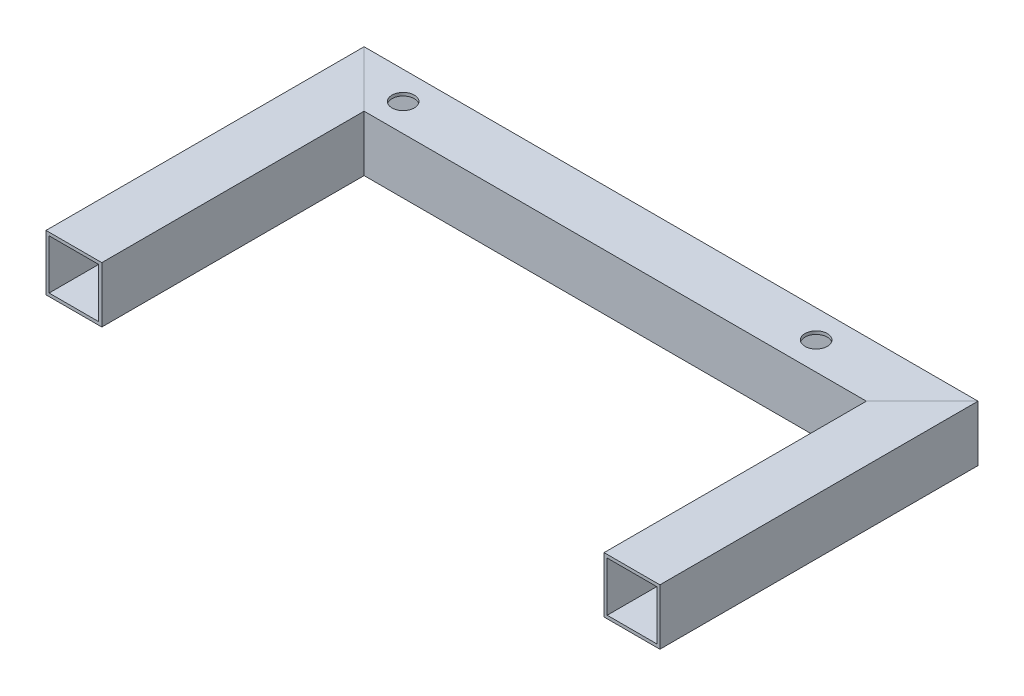
ISO-10303-21;
HEADER;
FILE_DESCRIPTION(('STEP AP214'),'2;1');
FILE_NAME('part.step','',(''),(''),'','','');
FILE_SCHEMA(('AUTOMOTIVE_DESIGN { 1 0 10303 214 1 1 1 1 }'));
ENDSEC;
DATA;
#1=APPLICATION_CONTEXT('core data for automotive mechanical design processes');
#2=APPLICATION_PROTOCOL_DEFINITION('international standard','automotive_design',2000,#1);
#3=PRODUCT_CONTEXT('',#1,'mechanical');
#4=PRODUCT('Part','Part','',(#3));
#5=PRODUCT_RELATED_PRODUCT_CATEGORY('part','',(#4));
#6=PRODUCT_DEFINITION_FORMATION('','',#4);
#7=PRODUCT_DEFINITION_CONTEXT('part definition',#1,'design');
#8=PRODUCT_DEFINITION('design','',#6,#7);
#9=PRODUCT_DEFINITION_SHAPE('','',#8);
#10=(LENGTH_UNIT() NAMED_UNIT(*) SI_UNIT(.MILLI.,.METRE.));
#11=(NAMED_UNIT(*) PLANE_ANGLE_UNIT() SI_UNIT($,.RADIAN.));
#12=(NAMED_UNIT(*) SI_UNIT($,.STERADIAN.) SOLID_ANGLE_UNIT());
#13=UNCERTAINTY_MEASURE_WITH_UNIT(LENGTH_MEASURE(1.E-05),#10,'distance_accuracy_value','');
#14=(GEOMETRIC_REPRESENTATION_CONTEXT(3) GLOBAL_UNCERTAINTY_ASSIGNED_CONTEXT((#13)) GLOBAL_UNIT_ASSIGNED_CONTEXT((#10,
#11,#12)) REPRESENTATION_CONTEXT('',''));
#15=CARTESIAN_POINT('',(0.,0.,0.));
#16=DIRECTION('',(0.,0.,1.));
#17=DIRECTION('',(1.,0.,0.));
#18=AXIS2_PLACEMENT_3D('',#15,#16,#17);
#19=CARTESIAN_POINT('',(137.5,-12.5,-13.8500000000001));
#20=DIRECTION('',(1.,0.,0.));
#21=DIRECTION('',(0.,0.,-1.));
#22=AXIS2_PLACEMENT_3D('',#19,#20,#21);
#23=PLANE('',#22);
#24=DIRECTION('',(0.,-1.,0.));
#25=VECTOR('',#24,1.);
#26=CARTESIAN_POINT('',(137.5,-12.5,-12.5000000000001));
#27=LINE('',#26,#25);
#28=CARTESIAN_POINT('',(137.5,12.5,-12.5000000000001));
#29=VERTEX_POINT('',#28);
#30=CARTESIAN_POINT('',(137.5,-12.5,-12.5000000000001));
#31=VERTEX_POINT('',#30);
#32=EDGE_CURVE('E196',#29,#31,#27,.T.);
#33=ORIENTED_EDGE('',*,*,#32,.F.);
#34=DIRECTION('',(0.,0.,1.));
#35=VECTOR('',#34,1.);
#36=CARTESIAN_POINT('',(137.5,12.5,-13.8500000000001));
#37=LINE('',#36,#35);
#38=CARTESIAN_POINT('',(137.5,12.5,130.));
#39=VERTEX_POINT('',#38);
#40=EDGE_CURVE('E152',#29,#39,#37,.T.);
#41=ORIENTED_EDGE('',*,*,#40,.T.);
#42=DIRECTION('',(0.,1.,0.));
#43=VECTOR('',#42,1.);
#44=CARTESIAN_POINT('',(137.5,-12.5,130.));
#45=LINE('',#44,#43);
#46=CARTESIAN_POINT('',(137.5,-12.5,130.));
#47=VERTEX_POINT('',#46);
#48=EDGE_CURVE('E358',#47,#39,#45,.T.);
#49=ORIENTED_EDGE('',*,*,#48,.F.);
#50=DIRECTION('',(0.,0.,1.));
#51=VECTOR('',#50,1.);
#52=CARTESIAN_POINT('',(137.5,-12.5,-13.8500000000001));
#53=LINE('',#52,#51);
#54=EDGE_CURVE('E189',#31,#47,#53,.T.);
#55=ORIENTED_EDGE('',*,*,#54,.F.);
#56=EDGE_LOOP('',(#33,#41,#49,#55));
#57=FACE_BOUND('',#56,.T.);
#58=ADVANCED_FACE('F43',(#57),#23,.T.);
#59=CARTESIAN_POINT('',(112.5,12.5,-13.85));
#60=DIRECTION('',(0.,1.,0.));
#61=DIRECTION('',(0.,0.,1.));
#62=AXIS2_PLACEMENT_3D('',#59,#60,#61);
#63=PLANE('',#62);
#64=DIRECTION('',(0.707106781186547,0.,-0.707106781186548));
#65=VECTOR('',#64,1.);
#66=CARTESIAN_POINT('',(-13.175,12.5,138.175));
#67=LINE('',#66,#65);
#68=CARTESIAN_POINT('',(112.5,12.5,12.5));
#69=VERTEX_POINT('',#68);
#70=EDGE_CURVE('E147',#69,#29,#67,.T.);
#71=ORIENTED_EDGE('',*,*,#70,.F.);
#72=DIRECTION('',(0.,0.,1.));
#73=VECTOR('',#72,1.);
#74=CARTESIAN_POINT('',(112.5,12.5,-13.85));
#75=LINE('',#74,#73);
#76=CARTESIAN_POINT('',(112.5,12.5,130.));
#77=VERTEX_POINT('',#76);
#78=EDGE_CURVE('E149',#69,#77,#75,.T.);
#79=ORIENTED_EDGE('',*,*,#78,.T.);
#80=DIRECTION('',(-1.,0.,0.));
#81=VECTOR('',#80,1.);
#82=CARTESIAN_POINT('',(112.5,12.5,130.));
#83=LINE('',#82,#81);
#84=EDGE_CURVE('E362',#39,#77,#83,.T.);
#85=ORIENTED_EDGE('',*,*,#84,.F.);
#86=ORIENTED_EDGE('',*,*,#40,.F.);
#87=EDGE_LOOP('',(#71,#79,#85,#86));
#88=FACE_BOUND('',#87,.T.);
#89=ADVANCED_FACE('F148',(#88),#63,.T.);
#90=CARTESIAN_POINT('',(112.5,-12.5,-13.85));
#91=DIRECTION('',(-1.,0.,0.));
#92=DIRECTION('',(0.,0.,1.));
#93=AXIS2_PLACEMENT_3D('',#90,#91,#92);
#94=PLANE('',#93);
#95=DIRECTION('',(0.,1.,0.));
#96=VECTOR('',#95,1.);
#97=CARTESIAN_POINT('',(112.5,-12.5,12.5));
#98=LINE('',#97,#96);
#99=CARTESIAN_POINT('',(112.5,-12.5,12.5));
#100=VERTEX_POINT('',#99);
#101=EDGE_CURVE('E140',#100,#69,#98,.T.);
#102=ORIENTED_EDGE('',*,*,#101,.F.);
#103=DIRECTION('',(0.,0.,1.));
#104=VECTOR('',#103,1.);
#105=CARTESIAN_POINT('',(112.5,-12.5,-13.85));
#106=LINE('',#105,#104);
#107=CARTESIAN_POINT('',(112.5,-12.5,130.));
#108=VERTEX_POINT('',#107);
#109=EDGE_CURVE('E164',#100,#108,#106,.T.);
#110=ORIENTED_EDGE('',*,*,#109,.T.);
#111=DIRECTION('',(0.,-1.,0.));
#112=VECTOR('',#111,1.);
#113=CARTESIAN_POINT('',(112.5,-12.5,130.));
#114=LINE('',#113,#112);
#115=EDGE_CURVE('E162',#77,#108,#114,.T.);
#116=ORIENTED_EDGE('',*,*,#115,.F.);
#117=ORIENTED_EDGE('',*,*,#78,.F.);
#118=EDGE_LOOP('',(#102,#110,#116,#117));
#119=FACE_BOUND('',#118,.T.);
#120=ADVANCED_FACE('F160',(#119),#94,.T.);
#121=CARTESIAN_POINT('',(112.5,-12.5,-13.85));
#122=DIRECTION('',(0.,-1.,0.));
#123=DIRECTION('',(1.,0.,0.));
#124=AXIS2_PLACEMENT_3D('',#121,#122,#123);
#125=PLANE('',#124);
#126=DIRECTION('',(-0.707106781186547,0.,0.707106781186548));
#127=VECTOR('',#126,1.);
#128=CARTESIAN_POINT('',(-13.175,-12.5,138.175));
#129=LINE('',#128,#127);
#130=EDGE_CURVE('E175',#31,#100,#129,.T.);
#131=ORIENTED_EDGE('',*,*,#130,.F.);
#132=ORIENTED_EDGE('',*,*,#54,.T.);
#133=DIRECTION('',(1.,0.,0.));
#134=VECTOR('',#133,1.);
#135=CARTESIAN_POINT('',(112.5,-12.5,130.));
#136=LINE('',#135,#134);
#137=EDGE_CURVE('E350',#108,#47,#136,.T.);
#138=ORIENTED_EDGE('',*,*,#137,.F.);
#139=ORIENTED_EDGE('',*,*,#109,.F.);
#140=EDGE_LOOP('',(#131,#132,#138,#139));
#141=FACE_BOUND('',#140,.T.);
#142=ADVANCED_FACE('F45',(#141),#125,.T.);
#143=CARTESIAN_POINT('',(-138.85,-12.5,12.5));
#144=DIRECTION('',(0.,-1.,0.));
#145=DIRECTION('',(0.,0.,-1.));
#146=AXIS2_PLACEMENT_3D('',#143,#144,#145);
#147=PLANE('',#146);
#148=CARTESIAN_POINT('',(77.5,-12.5,0.));
#149=DIRECTION('',(0.,-1.,0.));
#150=DIRECTION('',(0.,0.,-1.));
#151=AXIS2_PLACEMENT_3D('',#148,#149,#150);
#152=CIRCLE('',#151,5.);
#153=CARTESIAN_POINT('',(77.5,-12.5,-5.));
#154=VERTEX_POINT('',#153);
#155=EDGE_CURVE('E211',#154,#154,#152,.F.);
#156=ORIENTED_EDGE('',*,*,#155,.T.);
#157=EDGE_LOOP('',(#156));
#158=FACE_BOUND('',#157,.T.);
#159=CARTESIAN_POINT('',(-107.5,-12.5,0.));
#160=DIRECTION('',(0.,-1.,0.));
#161=DIRECTION('',(0.,0.,-1.));
#162=AXIS2_PLACEMENT_3D('',#159,#160,#161);
#163=CIRCLE('',#162,5.);
#164=CARTESIAN_POINT('',(-107.5,-12.5,-5.));
#165=VERTEX_POINT('',#164);
#166=EDGE_CURVE('E227',#165,#165,#163,.F.);
#167=ORIENTED_EDGE('',*,*,#166,.T.);
#168=EDGE_LOOP('',(#167));
#169=FACE_BOUND('',#168,.T.);
#170=DIRECTION('',(1.,0.,0.));
#171=VECTOR('',#170,1.);
#172=CARTESIAN_POINT('',(-138.85,-12.5,-12.5));
#173=LINE('',#172,#171);
#174=CARTESIAN_POINT('',(-137.5,-12.5,-12.5));
#175=VERTEX_POINT('',#174);
#176=EDGE_CURVE('E187',#175,#31,#173,.T.);
#177=ORIENTED_EDGE('',*,*,#176,.T.);
#178=ORIENTED_EDGE('',*,*,#130,.T.);
#179=DIRECTION('',(1.,0.,0.));
#180=VECTOR('',#179,1.);
#181=CARTESIAN_POINT('',(-138.85,-12.5,12.5));
#182=LINE('',#181,#180);
#183=CARTESIAN_POINT('',(-112.5,-12.5,12.5));
#184=VERTEX_POINT('',#183);
#185=EDGE_CURVE('E173',#184,#100,#182,.T.);
#186=ORIENTED_EDGE('',*,*,#185,.F.);
#187=DIRECTION('',(0.707106781186548,0.,0.707106781186547));
#188=VECTOR('',#187,1.);
#189=CARTESIAN_POINT('',(-53.75,-12.5,71.25));
#190=LINE('',#189,#188);
#191=EDGE_CURVE('E372',#175,#184,#190,.T.);
#192=ORIENTED_EDGE('',*,*,#191,.F.);
#193=EDGE_LOOP('',(#177,#178,#186,#192));
#194=FACE_BOUND('',#193,.T.);
#195=ADVANCED_FACE('F399',(#158,#169,#194),#147,.T.);
#196=CARTESIAN_POINT('',(-138.85,-12.5,12.5));
#197=DIRECTION('',(0.,0.,1.));
#198=DIRECTION('',(1.,0.,0.));
#199=AXIS2_PLACEMENT_3D('',#196,#197,#198);
#200=PLANE('',#199);
#201=ORIENTED_EDGE('',*,*,#185,.T.);
#202=ORIENTED_EDGE('',*,*,#101,.T.);
#203=DIRECTION('',(1.,0.,0.));
#204=VECTOR('',#203,1.);
#205=CARTESIAN_POINT('',(-138.85,12.5,12.5));
#206=LINE('',#205,#204);
#207=CARTESIAN_POINT('',(-112.5,12.5,12.5));
#208=VERTEX_POINT('',#207);
#209=EDGE_CURVE('E170',#208,#69,#206,.T.);
#210=ORIENTED_EDGE('',*,*,#209,.F.);
#211=DIRECTION('',(0.,1.,0.));
#212=VECTOR('',#211,1.);
#213=CARTESIAN_POINT('',(-112.5,-12.5,12.5));
#214=LINE('',#213,#212);
#215=EDGE_CURVE('E369',#184,#208,#214,.T.);
#216=ORIENTED_EDGE('',*,*,#215,.F.);
#217=EDGE_LOOP('',(#201,#202,#210,#216));
#218=FACE_BOUND('',#217,.T.);
#219=ADVANCED_FACE('F169',(#218),#200,.T.);
#220=CARTESIAN_POINT('',(-138.85,12.5,12.5));
#221=DIRECTION('',(0.,1.,0.));
#222=DIRECTION('',(0.,0.,1.));
#223=AXIS2_PLACEMENT_3D('',#220,#221,#222);
#224=PLANE('',#223);
#225=CARTESIAN_POINT('',(77.5,12.5,0.));
#226=DIRECTION('',(0.,1.,0.));
#227=DIRECTION('',(0.,0.,1.));
#228=AXIS2_PLACEMENT_3D('',#225,#226,#227);
#229=CIRCLE('',#228,5.);
#230=CARTESIAN_POINT('',(77.5,12.5,5.));
#231=VERTEX_POINT('',#230);
#232=EDGE_CURVE('E220',#231,#231,#229,.T.);
#233=ORIENTED_EDGE('',*,*,#232,.F.);
#234=EDGE_LOOP('',(#233));
#235=FACE_BOUND('',#234,.T.);
#236=CARTESIAN_POINT('',(-107.5,12.5,0.));
#237=DIRECTION('',(0.,1.,0.));
#238=DIRECTION('',(0.,0.,1.));
#239=AXIS2_PLACEMENT_3D('',#236,#237,#238);
#240=CIRCLE('',#239,5.);
#241=CARTESIAN_POINT('',(-107.5,12.5,5.));
#242=VERTEX_POINT('',#241);
#243=EDGE_CURVE('E230',#242,#242,#240,.T.);
#244=ORIENTED_EDGE('',*,*,#243,.F.);
#245=EDGE_LOOP('',(#244));
#246=FACE_BOUND('',#245,.T.);
#247=ORIENTED_EDGE('',*,*,#209,.T.);
#248=ORIENTED_EDGE('',*,*,#70,.T.);
#249=DIRECTION('',(1.,0.,0.));
#250=VECTOR('',#249,1.);
#251=CARTESIAN_POINT('',(-138.85,12.5,-12.5));
#252=LINE('',#251,#250);
#253=CARTESIAN_POINT('',(-137.5,12.5,-12.5));
#254=VERTEX_POINT('',#253);
#255=EDGE_CURVE('E181',#254,#29,#252,.T.);
#256=ORIENTED_EDGE('',*,*,#255,.F.);
#257=DIRECTION('',(-0.707106781186548,0.,-0.707106781186547));
#258=VECTOR('',#257,1.);
#259=CARTESIAN_POINT('',(-53.75,12.5,71.25));
#260=LINE('',#259,#258);
#261=EDGE_CURVE('E179',#208,#254,#260,.T.);
#262=ORIENTED_EDGE('',*,*,#261,.F.);
#263=EDGE_LOOP('',(#247,#248,#256,#262));
#264=FACE_BOUND('',#263,.T.);
#265=ADVANCED_FACE('F177',(#235,#246,#264),#224,.T.);
#266=CARTESIAN_POINT('',(-138.85,-12.5,-12.5));
#267=DIRECTION('',(0.,0.,-1.));
#268=DIRECTION('',(-1.,0.,0.));
#269=AXIS2_PLACEMENT_3D('',#266,#267,#268);
#270=PLANE('',#269);
#271=ORIENTED_EDGE('',*,*,#255,.T.);
#272=ORIENTED_EDGE('',*,*,#32,.T.);
#273=ORIENTED_EDGE('',*,*,#176,.F.);
#274=DIRECTION('',(0.,-1.,0.));
#275=VECTOR('',#274,1.);
#276=CARTESIAN_POINT('',(-137.5,-12.5,-12.5));
#277=LINE('',#276,#275);
#278=EDGE_CURVE('E376',#254,#175,#277,.T.);
#279=ORIENTED_EDGE('',*,*,#278,.F.);
#280=EDGE_LOOP('',(#271,#272,#273,#279));
#281=FACE_BOUND('',#280,.T.);
#282=ADVANCED_FACE('F405',(#281),#270,.T.);
#283=CARTESIAN_POINT('',(-112.5,-12.5,130.));
#284=DIRECTION('',(0.,-1.,0.));
#285=DIRECTION('',(1.,0.,0.));
#286=AXIS2_PLACEMENT_3D('',#283,#284,#285);
#287=PLANE('',#286);
#288=DIRECTION('',(0.,0.,-1.));
#289=VECTOR('',#288,1.);
#290=CARTESIAN_POINT('',(-137.5,-12.5,130.));
#291=LINE('',#290,#289);
#292=CARTESIAN_POINT('',(-137.5,-12.5,130.));
#293=VERTEX_POINT('',#292);
#294=EDGE_CURVE('E158',#293,#175,#291,.T.);
#295=ORIENTED_EDGE('',*,*,#294,.T.);
#296=ORIENTED_EDGE('',*,*,#191,.T.);
#297=DIRECTION('',(0.,0.,-1.));
#298=VECTOR('',#297,1.);
#299=CARTESIAN_POINT('',(-112.5,-12.5,130.));
#300=LINE('',#299,#298);
#301=CARTESIAN_POINT('',(-112.5,-12.5,130.));
#302=VERTEX_POINT('',#301);
#303=EDGE_CURVE('E388',#302,#184,#300,.T.);
#304=ORIENTED_EDGE('',*,*,#303,.F.);
#305=DIRECTION('',(-1.,0.,0.));
#306=VECTOR('',#305,1.);
#307=CARTESIAN_POINT('',(-112.5,-12.5,130.));
#308=LINE('',#307,#306);
#309=EDGE_CURVE('E319',#302,#293,#308,.T.);
#310=ORIENTED_EDGE('',*,*,#309,.T.);
#311=EDGE_LOOP('',(#295,#296,#304,#310));
#312=FACE_BOUND('',#311,.T.);
#313=ADVANCED_FACE('F424',(#312),#287,.T.);
#314=CARTESIAN_POINT('',(-112.5,-12.5,130.));
#315=DIRECTION('',(1.,0.,0.));
#316=DIRECTION('',(0.,0.,-1.));
#317=AXIS2_PLACEMENT_3D('',#314,#315,#316);
#318=PLANE('',#317);
#319=ORIENTED_EDGE('',*,*,#303,.T.);
#320=ORIENTED_EDGE('',*,*,#215,.T.);
#321=DIRECTION('',(0.,0.,-1.));
#322=VECTOR('',#321,1.);
#323=CARTESIAN_POINT('',(-112.5,12.5,130.));
#324=LINE('',#323,#322);
#325=CARTESIAN_POINT('',(-112.5,12.5,130.));
#326=VERTEX_POINT('',#325);
#327=EDGE_CURVE('E381',#326,#208,#324,.T.);
#328=ORIENTED_EDGE('',*,*,#327,.F.);
#329=DIRECTION('',(0.,-1.,0.));
#330=VECTOR('',#329,1.);
#331=CARTESIAN_POINT('',(-112.5,-12.5,130.));
#332=LINE('',#331,#330);
#333=EDGE_CURVE('E345',#326,#302,#332,.T.);
#334=ORIENTED_EDGE('',*,*,#333,.T.);
#335=EDGE_LOOP('',(#319,#320,#328,#334));
#336=FACE_BOUND('',#335,.T.);
#337=ADVANCED_FACE('F421',(#336),#318,.T.);
#338=CARTESIAN_POINT('',(-112.5,12.5,130.));
#339=DIRECTION('',(0.,1.,0.));
#340=DIRECTION('',(0.,0.,1.));
#341=AXIS2_PLACEMENT_3D('',#338,#339,#340);
#342=PLANE('',#341);
#343=ORIENTED_EDGE('',*,*,#327,.T.);
#344=ORIENTED_EDGE('',*,*,#261,.T.);
#345=DIRECTION('',(0.,0.,-1.));
#346=VECTOR('',#345,1.);
#347=CARTESIAN_POINT('',(-137.5,12.5,130.));
#348=LINE('',#347,#346);
#349=CARTESIAN_POINT('',(-137.5,12.5,130.));
#350=VERTEX_POINT('',#349);
#351=EDGE_CURVE('E377',#350,#254,#348,.T.);
#352=ORIENTED_EDGE('',*,*,#351,.F.);
#353=DIRECTION('',(1.,0.,0.));
#354=VECTOR('',#353,1.);
#355=CARTESIAN_POINT('',(-112.5,12.5,130.));
#356=LINE('',#355,#354);
#357=EDGE_CURVE('E349',#350,#326,#356,.T.);
#358=ORIENTED_EDGE('',*,*,#357,.T.);
#359=EDGE_LOOP('',(#343,#344,#352,#358));
#360=FACE_BOUND('',#359,.T.);
#361=ADVANCED_FACE('F408',(#360),#342,.T.);
#362=CARTESIAN_POINT('',(-137.5,-12.5,130.));
#363=DIRECTION('',(-1.,0.,0.));
#364=DIRECTION('',(0.,0.,1.));
#365=AXIS2_PLACEMENT_3D('',#362,#363,#364);
#366=PLANE('',#365);
#367=ORIENTED_EDGE('',*,*,#351,.T.);
#368=ORIENTED_EDGE('',*,*,#278,.T.);
#369=ORIENTED_EDGE('',*,*,#294,.F.);
#370=DIRECTION('',(0.,1.,0.));
#371=VECTOR('',#370,1.);
#372=CARTESIAN_POINT('',(-137.5,-12.5,130.));
#373=LINE('',#372,#371);
#374=EDGE_CURVE('E346',#293,#350,#373,.T.);
#375=ORIENTED_EDGE('',*,*,#374,.T.);
#376=EDGE_LOOP('',(#367,#368,#369,#375));
#377=FACE_BOUND('',#376,.T.);
#378=ADVANCED_FACE('F412',(#377),#366,.T.);
#379=CARTESIAN_POINT('',(0.,0.,130.));
#380=DIRECTION('',(0.,0.,-1.));
#381=DIRECTION('',(-1.,0.,0.));
#382=AXIS2_PLACEMENT_3D('',#379,#380,#381);
#383=PLANE('',#382);
#384=ORIENTED_EDGE('',*,*,#48,.T.);
#385=ORIENTED_EDGE('',*,*,#84,.T.);
#386=ORIENTED_EDGE('',*,*,#115,.T.);
#387=ORIENTED_EDGE('',*,*,#137,.T.);
#388=EDGE_LOOP('',(#384,#385,#386,#387));
#389=FACE_BOUND('',#388,.T.);
#390=DIRECTION('',(0.,1.,0.));
#391=VECTOR('',#390,1.);
#392=CARTESIAN_POINT('',(136.1,-11.1,130.));
#393=LINE('',#392,#391);
#394=CARTESIAN_POINT('',(136.1,11.1,130.));
#395=VERTEX_POINT('',#394);
#396=CARTESIAN_POINT('',(136.1,-11.1,130.));
#397=VERTEX_POINT('',#396);
#398=EDGE_CURVE('E315',#395,#397,#393,.F.);
#399=ORIENTED_EDGE('',*,*,#398,.T.);
#400=DIRECTION('',(1.,0.,0.));
#401=VECTOR('',#400,1.);
#402=CARTESIAN_POINT('',(113.9,-11.1,130.));
#403=LINE('',#402,#401);
#404=CARTESIAN_POINT('',(113.9,-11.1,130.));
#405=VERTEX_POINT('',#404);
#406=EDGE_CURVE('E325',#397,#405,#403,.F.);
#407=ORIENTED_EDGE('',*,*,#406,.T.);
#408=DIRECTION('',(0.,-1.,0.));
#409=VECTOR('',#408,1.);
#410=CARTESIAN_POINT('',(113.9,-11.1,130.));
#411=LINE('',#410,#409);
#412=CARTESIAN_POINT('',(113.9,11.1,130.));
#413=VERTEX_POINT('',#412);
#414=EDGE_CURVE('E322',#405,#413,#411,.F.);
#415=ORIENTED_EDGE('',*,*,#414,.T.);
#416=DIRECTION('',(-1.,0.,0.));
#417=VECTOR('',#416,1.);
#418=CARTESIAN_POINT('',(113.9,11.1,130.));
#419=LINE('',#418,#417);
#420=EDGE_CURVE('E318',#413,#395,#419,.F.);
#421=ORIENTED_EDGE('',*,*,#420,.T.);
#422=EDGE_LOOP('',(#399,#407,#415,#421));
#423=FACE_BOUND('',#422,.T.);
#424=ADVANCED_FACE('F491',(#389,#423),#383,.F.);
#425=CARTESIAN_POINT('',(0.,0.,130.));
#426=DIRECTION('',(0.,0.,1.));
#427=DIRECTION('',(1.,0.,0.));
#428=AXIS2_PLACEMENT_3D('',#425,#426,#427);
#429=PLANE('',#428);
#430=ORIENTED_EDGE('',*,*,#374,.F.);
#431=ORIENTED_EDGE('',*,*,#309,.F.);
#432=ORIENTED_EDGE('',*,*,#333,.F.);
#433=ORIENTED_EDGE('',*,*,#357,.F.);
#434=EDGE_LOOP('',(#430,#431,#432,#433));
#435=FACE_BOUND('',#434,.T.);
#436=DIRECTION('',(0.,1.,0.));
#437=VECTOR('',#436,1.);
#438=CARTESIAN_POINT('',(-136.1,-11.1,130.));
#439=LINE('',#438,#437);
#440=CARTESIAN_POINT('',(-136.1,11.1,130.));
#441=VERTEX_POINT('',#440);
#442=CARTESIAN_POINT('',(-136.1,-11.1,130.));
#443=VERTEX_POINT('',#442);
#444=EDGE_CURVE('E263',#441,#443,#439,.F.);
#445=ORIENTED_EDGE('',*,*,#444,.F.);
#446=DIRECTION('',(1.,0.,0.));
#447=VECTOR('',#446,1.);
#448=CARTESIAN_POINT('',(-113.9,11.1,130.));
#449=LINE('',#448,#447);
#450=CARTESIAN_POINT('',(-113.9,11.1,130.));
#451=VERTEX_POINT('',#450);
#452=EDGE_CURVE('E267',#451,#441,#449,.F.);
#453=ORIENTED_EDGE('',*,*,#452,.F.);
#454=DIRECTION('',(0.,-1.,0.));
#455=VECTOR('',#454,1.);
#456=CARTESIAN_POINT('',(-113.9,-11.1,130.));
#457=LINE('',#456,#455);
#458=CARTESIAN_POINT('',(-113.9,-11.1,130.));
#459=VERTEX_POINT('',#458);
#460=EDGE_CURVE('E252',#459,#451,#457,.F.);
#461=ORIENTED_EDGE('',*,*,#460,.F.);
#462=DIRECTION('',(-1.,0.,0.));
#463=VECTOR('',#462,1.);
#464=CARTESIAN_POINT('',(-113.9,-11.1,130.));
#465=LINE('',#464,#463);
#466=EDGE_CURVE('E248',#443,#459,#465,.F.);
#467=ORIENTED_EDGE('',*,*,#466,.F.);
#468=EDGE_LOOP('',(#445,#453,#461,#467));
#469=FACE_BOUND('',#468,.T.);
#470=ADVANCED_FACE('F417',(#435,#469),#429,.T.);
#471=CARTESIAN_POINT('',(113.9,-11.1,-12.31));
#472=DIRECTION('',(0.,1.,0.));
#473=DIRECTION('',(0.,0.,1.));
#474=AXIS2_PLACEMENT_3D('',#471,#472,#473);
#475=PLANE('',#474);
#476=DIRECTION('',(0.707106781186547,0.,-0.707106781186548));
#477=VECTOR('',#476,1.);
#478=CARTESIAN_POINT('',(-11.705,-11.1,136.705));
#479=LINE('',#478,#477);
#480=CARTESIAN_POINT('',(113.9,-11.1,11.0999999999999));
#481=VERTEX_POINT('',#480);
#482=CARTESIAN_POINT('',(136.1,-11.1,-11.1000000000001));
#483=VERTEX_POINT('',#482);
#484=EDGE_CURVE('E295',#481,#483,#479,.T.);
#485=ORIENTED_EDGE('',*,*,#484,.F.);
#486=DIRECTION('',(0.,0.,1.));
#487=VECTOR('',#486,1.);
#488=CARTESIAN_POINT('',(113.9,-11.1,-12.31));
#489=LINE('',#488,#487);
#490=EDGE_CURVE('E336',#481,#405,#489,.T.);
#491=ORIENTED_EDGE('',*,*,#490,.T.);
#492=ORIENTED_EDGE('',*,*,#406,.F.);
#493=DIRECTION('',(0.,0.,1.));
#494=VECTOR('',#493,1.);
#495=CARTESIAN_POINT('',(136.1,-11.1,-12.31));
#496=LINE('',#495,#494);
#497=EDGE_CURVE('E301',#483,#397,#496,.T.);
#498=ORIENTED_EDGE('',*,*,#497,.F.);
#499=EDGE_LOOP('',(#485,#491,#492,#498));
#500=FACE_BOUND('',#499,.T.);
#501=ADVANCED_FACE('F474',(#500),#475,.T.);
#502=CARTESIAN_POINT('',(113.9,-11.1,-12.31));
#503=DIRECTION('',(1.,0.,0.));
#504=DIRECTION('',(0.,0.,-1.));
#505=AXIS2_PLACEMENT_3D('',#502,#503,#504);
#506=PLANE('',#505);
#507=DIRECTION('',(0.,-1.,0.));
#508=VECTOR('',#507,1.);
#509=CARTESIAN_POINT('',(113.9,-11.1,11.1));
#510=LINE('',#509,#508);
#511=CARTESIAN_POINT('',(113.9,11.1,11.1));
#512=VERTEX_POINT('',#511);
#513=EDGE_CURVE('E253',#512,#481,#510,.T.);
#514=ORIENTED_EDGE('',*,*,#513,.F.);
#515=DIRECTION('',(0.,0.,1.));
#516=VECTOR('',#515,1.);
#517=CARTESIAN_POINT('',(113.9,11.1,-12.31));
#518=LINE('',#517,#516);
#519=EDGE_CURVE('E332',#512,#413,#518,.T.);
#520=ORIENTED_EDGE('',*,*,#519,.T.);
#521=ORIENTED_EDGE('',*,*,#414,.F.);
#522=ORIENTED_EDGE('',*,*,#490,.F.);
#523=EDGE_LOOP('',(#514,#520,#521,#522));
#524=FACE_BOUND('',#523,.T.);
#525=ADVANCED_FACE('F477',(#524),#506,.T.);
#526=CARTESIAN_POINT('',(113.9,11.1,-12.31));
#527=DIRECTION('',(0.,-1.,0.));
#528=DIRECTION('',(0.,0.,-1.));
#529=AXIS2_PLACEMENT_3D('',#526,#527,#528);
#530=PLANE('',#529);
#531=DIRECTION('',(-0.707106781186547,0.,0.707106781186548));
#532=VECTOR('',#531,1.);
#533=CARTESIAN_POINT('',(-11.705,11.1,136.705));
#534=LINE('',#533,#532);
#535=CARTESIAN_POINT('',(136.1,11.1,-11.1000000000001));
#536=VERTEX_POINT('',#535);
#537=EDGE_CURVE('E287',#536,#512,#534,.T.);
#538=ORIENTED_EDGE('',*,*,#537,.F.);
#539=DIRECTION('',(0.,0.,1.));
#540=VECTOR('',#539,1.);
#541=CARTESIAN_POINT('',(136.1,11.1,-12.31));
#542=LINE('',#541,#540);
#543=EDGE_CURVE('E328',#536,#395,#542,.T.);
#544=ORIENTED_EDGE('',*,*,#543,.T.);
#545=ORIENTED_EDGE('',*,*,#420,.F.);
#546=ORIENTED_EDGE('',*,*,#519,.F.);
#547=EDGE_LOOP('',(#538,#544,#545,#546));
#548=FACE_BOUND('',#547,.T.);
#549=ADVANCED_FACE('F481',(#548),#530,.T.);
#550=CARTESIAN_POINT('',(136.1,-11.1,-12.31));
#551=DIRECTION('',(-1.,0.,0.));
#552=DIRECTION('',(0.,0.,1.));
#553=AXIS2_PLACEMENT_3D('',#550,#551,#552);
#554=PLANE('',#553);
#555=DIRECTION('',(0.,1.,0.));
#556=VECTOR('',#555,1.);
#557=CARTESIAN_POINT('',(136.1,-11.1,-11.1000000000001));
#558=LINE('',#557,#556);
#559=EDGE_CURVE('E291',#483,#536,#558,.T.);
#560=ORIENTED_EDGE('',*,*,#559,.F.);
#561=ORIENTED_EDGE('',*,*,#497,.T.);
#562=ORIENTED_EDGE('',*,*,#398,.F.);
#563=ORIENTED_EDGE('',*,*,#543,.F.);
#564=EDGE_LOOP('',(#560,#561,#562,#563));
#565=FACE_BOUND('',#564,.T.);
#566=ADVANCED_FACE('F472',(#565),#554,.T.);
#567=CARTESIAN_POINT('',(-137.31,-11.1,-11.1));
#568=DIRECTION('',(0.,0.,1.));
#569=DIRECTION('',(1.,0.,0.));
#570=AXIS2_PLACEMENT_3D('',#567,#568,#569);
#571=PLANE('',#570);
#572=DIRECTION('',(1.,0.,0.));
#573=VECTOR('',#572,1.);
#574=CARTESIAN_POINT('',(-137.31,-11.1,-11.1));
#575=LINE('',#574,#573);
#576=CARTESIAN_POINT('',(-136.1,-11.1,-11.1));
#577=VERTEX_POINT('',#576);
#578=EDGE_CURVE('E308',#577,#483,#575,.T.);
#579=ORIENTED_EDGE('',*,*,#578,.T.);
#580=ORIENTED_EDGE('',*,*,#559,.T.);
#581=DIRECTION('',(1.,0.,0.));
#582=VECTOR('',#581,1.);
#583=CARTESIAN_POINT('',(-137.31,11.1,-11.1));
#584=LINE('',#583,#582);
#585=CARTESIAN_POINT('',(-136.1,11.1,-11.1));
#586=VERTEX_POINT('',#585);
#587=EDGE_CURVE('E296',#586,#536,#584,.T.);
#588=ORIENTED_EDGE('',*,*,#587,.F.);
#589=DIRECTION('',(0.,1.,0.));
#590=VECTOR('',#589,1.);
#591=CARTESIAN_POINT('',(-136.1,-11.1,-11.0999999999999));
#592=LINE('',#591,#590);
#593=EDGE_CURVE('E243',#577,#586,#592,.T.);
#594=ORIENTED_EDGE('',*,*,#593,.F.);
#595=EDGE_LOOP('',(#579,#580,#588,#594));
#596=FACE_BOUND('',#595,.T.);
#597=ADVANCED_FACE('F468',(#596),#571,.T.);
#598=CARTESIAN_POINT('',(-137.31,11.1,11.1));
#599=DIRECTION('',(0.,-1.,0.));
#600=DIRECTION('',(0.,0.,-1.));
#601=AXIS2_PLACEMENT_3D('',#598,#599,#600);
#602=PLANE('',#601);
#603=CARTESIAN_POINT('',(77.5,11.1,0.));
#604=DIRECTION('',(0.,-1.,0.));
#605=DIRECTION('',(0.,0.,-1.));
#606=AXIS2_PLACEMENT_3D('',#603,#604,#605);
#607=CIRCLE('',#606,5.);
#608=CARTESIAN_POINT('',(77.5,11.1,-5.));
#609=VERTEX_POINT('',#608);
#610=EDGE_CURVE('E201',#609,#609,#607,.T.);
#611=ORIENTED_EDGE('',*,*,#610,.F.);
#612=EDGE_LOOP('',(#611));
#613=FACE_BOUND('',#612,.T.);
#614=CARTESIAN_POINT('',(-107.5,11.1,0.));
#615=DIRECTION('',(0.,-1.,0.));
#616=DIRECTION('',(0.,0.,-1.));
#617=AXIS2_PLACEMENT_3D('',#614,#615,#616);
#618=CIRCLE('',#617,5.);
#619=CARTESIAN_POINT('',(-107.5,11.1,-5.));
#620=VERTEX_POINT('',#619);
#621=EDGE_CURVE('E210',#620,#620,#618,.T.);
#622=ORIENTED_EDGE('',*,*,#621,.F.);
#623=EDGE_LOOP('',(#622));
#624=FACE_BOUND('',#623,.T.);
#625=ORIENTED_EDGE('',*,*,#587,.T.);
#626=ORIENTED_EDGE('',*,*,#537,.T.);
#627=DIRECTION('',(1.,0.,0.));
#628=VECTOR('',#627,1.);
#629=CARTESIAN_POINT('',(-137.31,11.1,11.1));
#630=LINE('',#629,#628);
#631=CARTESIAN_POINT('',(-113.9,11.1,11.1));
#632=VERTEX_POINT('',#631);
#633=EDGE_CURVE('E300',#632,#512,#630,.T.);
#634=ORIENTED_EDGE('',*,*,#633,.F.);
#635=DIRECTION('',(0.707106781186548,0.,0.707106781186547));
#636=VECTOR('',#635,1.);
#637=CARTESIAN_POINT('',(-54.45,11.1,70.55));
#638=LINE('',#637,#636);
#639=EDGE_CURVE('E54',#586,#632,#638,.T.);
#640=ORIENTED_EDGE('',*,*,#639,.F.);
#641=EDGE_LOOP('',(#625,#626,#634,#640));
#642=FACE_BOUND('',#641,.T.);
#643=ADVANCED_FACE('F465',(#613,#624,#642),#602,.T.);
#644=CARTESIAN_POINT('',(-137.31,-11.1,11.1));
#645=DIRECTION('',(0.,0.,-1.));
#646=DIRECTION('',(-1.,0.,0.));
#647=AXIS2_PLACEMENT_3D('',#644,#645,#646);
#648=PLANE('',#647);
#649=ORIENTED_EDGE('',*,*,#633,.T.);
#650=ORIENTED_EDGE('',*,*,#513,.T.);
#651=DIRECTION('',(1.,0.,0.));
#652=VECTOR('',#651,1.);
#653=CARTESIAN_POINT('',(-137.31,-11.1,11.1));
#654=LINE('',#653,#652);
#655=CARTESIAN_POINT('',(-113.9,-11.1,11.1));
#656=VERTEX_POINT('',#655);
#657=EDGE_CURVE('E304',#656,#481,#654,.T.);
#658=ORIENTED_EDGE('',*,*,#657,.F.);
#659=DIRECTION('',(0.,-1.,0.));
#660=VECTOR('',#659,1.);
#661=CARTESIAN_POINT('',(-113.9,-11.1,11.1));
#662=LINE('',#661,#660);
#663=EDGE_CURVE('E11',#632,#656,#662,.T.);
#664=ORIENTED_EDGE('',*,*,#663,.F.);
#665=EDGE_LOOP('',(#649,#650,#658,#664));
#666=FACE_BOUND('',#665,.T.);
#667=ADVANCED_FACE('F461',(#666),#648,.T.);
#668=CARTESIAN_POINT('',(-137.31,-11.1,11.1));
#669=DIRECTION('',(0.,1.,0.));
#670=DIRECTION('',(0.,0.,1.));
#671=AXIS2_PLACEMENT_3D('',#668,#669,#670);
#672=PLANE('',#671);
#673=CARTESIAN_POINT('',(77.5,-11.1,0.));
#674=DIRECTION('',(0.,1.,0.));
#675=DIRECTION('',(0.,0.,1.));
#676=AXIS2_PLACEMENT_3D('',#673,#674,#675);
#677=CIRCLE('',#676,5.);
#678=CARTESIAN_POINT('',(77.5,-11.1,5.));
#679=VERTEX_POINT('',#678);
#680=EDGE_CURVE('E47',#679,#679,#677,.T.);
#681=ORIENTED_EDGE('',*,*,#680,.F.);
#682=EDGE_LOOP('',(#681));
#683=FACE_BOUND('',#682,.T.);
#684=CARTESIAN_POINT('',(-107.5,-11.1,0.));
#685=DIRECTION('',(0.,1.,0.));
#686=DIRECTION('',(0.,0.,1.));
#687=AXIS2_PLACEMENT_3D('',#684,#685,#686);
#688=CIRCLE('',#687,5.);
#689=CARTESIAN_POINT('',(-107.5,-11.1,5.));
#690=VERTEX_POINT('',#689);
#691=EDGE_CURVE('E207',#690,#690,#688,.T.);
#692=ORIENTED_EDGE('',*,*,#691,.F.);
#693=EDGE_LOOP('',(#692));
#694=FACE_BOUND('',#693,.T.);
#695=ORIENTED_EDGE('',*,*,#657,.T.);
#696=ORIENTED_EDGE('',*,*,#484,.T.);
#697=ORIENTED_EDGE('',*,*,#578,.F.);
#698=DIRECTION('',(-0.707106781186548,0.,-0.707106781186547));
#699=VECTOR('',#698,1.);
#700=CARTESIAN_POINT('',(-54.45,-11.1,70.55));
#701=LINE('',#700,#699);
#702=EDGE_CURVE('E247',#656,#577,#701,.T.);
#703=ORIENTED_EDGE('',*,*,#702,.F.);
#704=EDGE_LOOP('',(#695,#696,#697,#703));
#705=FACE_BOUND('',#704,.T.);
#706=ADVANCED_FACE('F457',(#683,#694,#705),#672,.T.);
#707=CARTESIAN_POINT('',(-136.1,-11.1,130.));
#708=DIRECTION('',(1.,0.,0.));
#709=DIRECTION('',(0.,0.,-1.));
#710=AXIS2_PLACEMENT_3D('',#707,#708,#709);
#711=PLANE('',#710);
#712=DIRECTION('',(0.,0.,-1.));
#713=VECTOR('',#712,1.);
#714=CARTESIAN_POINT('',(-136.1,-11.1,130.));
#715=LINE('',#714,#713);
#716=EDGE_CURVE('E259',#443,#577,#715,.T.);
#717=ORIENTED_EDGE('',*,*,#716,.T.);
#718=ORIENTED_EDGE('',*,*,#593,.T.);
#719=DIRECTION('',(0.,0.,-1.));
#720=VECTOR('',#719,1.);
#721=CARTESIAN_POINT('',(-136.1,11.1,130.));
#722=LINE('',#721,#720);
#723=EDGE_CURVE('E271',#441,#586,#722,.T.);
#724=ORIENTED_EDGE('',*,*,#723,.F.);
#725=ORIENTED_EDGE('',*,*,#444,.T.);
#726=EDGE_LOOP('',(#717,#718,#724,#725));
#727=FACE_BOUND('',#726,.T.);
#728=ADVANCED_FACE('F453',(#727),#711,.T.);
#729=CARTESIAN_POINT('',(-113.9,11.1,130.));
#730=DIRECTION('',(0.,-1.,0.));
#731=DIRECTION('',(0.,0.,-1.));
#732=AXIS2_PLACEMENT_3D('',#729,#730,#731);
#733=PLANE('',#732);
#734=ORIENTED_EDGE('',*,*,#723,.T.);
#735=ORIENTED_EDGE('',*,*,#639,.T.);
#736=DIRECTION('',(0.,0.,-1.));
#737=VECTOR('',#736,1.);
#738=CARTESIAN_POINT('',(-113.9,11.1,130.));
#739=LINE('',#738,#737);
#740=EDGE_CURVE('E258',#451,#632,#739,.T.);
#741=ORIENTED_EDGE('',*,*,#740,.F.);
#742=ORIENTED_EDGE('',*,*,#452,.T.);
#743=EDGE_LOOP('',(#734,#735,#741,#742));
#744=FACE_BOUND('',#743,.T.);
#745=ADVANCED_FACE('F446',(#744),#733,.T.);
#746=CARTESIAN_POINT('',(-113.9,-11.1,130.));
#747=DIRECTION('',(-1.,0.,0.));
#748=DIRECTION('',(0.,0.,1.));
#749=AXIS2_PLACEMENT_3D('',#746,#747,#748);
#750=PLANE('',#749);
#751=ORIENTED_EDGE('',*,*,#740,.T.);
#752=ORIENTED_EDGE('',*,*,#663,.T.);
#753=DIRECTION('',(0.,0.,-1.));
#754=VECTOR('',#753,1.);
#755=CARTESIAN_POINT('',(-113.9,-11.1,130.));
#756=LINE('',#755,#754);
#757=EDGE_CURVE('E254',#459,#656,#756,.T.);
#758=ORIENTED_EDGE('',*,*,#757,.F.);
#759=ORIENTED_EDGE('',*,*,#460,.T.);
#760=EDGE_LOOP('',(#751,#752,#758,#759));
#761=FACE_BOUND('',#760,.T.);
#762=ADVANCED_FACE('F436',(#761),#750,.T.);
#763=CARTESIAN_POINT('',(-113.9,-11.1,130.));
#764=DIRECTION('',(0.,1.,0.));
#765=DIRECTION('',(0.,0.,1.));
#766=AXIS2_PLACEMENT_3D('',#763,#764,#765);
#767=PLANE('',#766);
#768=ORIENTED_EDGE('',*,*,#757,.T.);
#769=ORIENTED_EDGE('',*,*,#702,.T.);
#770=ORIENTED_EDGE('',*,*,#716,.F.);
#771=ORIENTED_EDGE('',*,*,#466,.T.);
#772=EDGE_LOOP('',(#768,#769,#770,#771));
#773=FACE_BOUND('',#772,.T.);
#774=ADVANCED_FACE('F433',(#773),#767,.T.);
#775=CARTESIAN_POINT('',(-107.5,-26.642135623731,0.));
#776=DIRECTION('',(0.,1.,0.));
#777=DIRECTION('',(0.,0.,1.));
#778=AXIS2_PLACEMENT_3D('',#775,#776,#777);
#779=CYLINDRICAL_SURFACE('',#778,5.);
#780=ORIENTED_EDGE('',*,*,#691,.T.);
#781=EDGE_LOOP('',(#780));
#782=FACE_BOUND('',#781,.T.);
#783=ORIENTED_EDGE('',*,*,#166,.F.);
#784=EDGE_LOOP('',(#783));
#785=FACE_BOUND('',#784,.T.);
#786=ADVANCED_FACE('F435',(#782,#785),#779,.F.);
#787=CARTESIAN_POINT('',(77.5,-26.642135623731,0.));
#788=DIRECTION('',(0.,1.,0.));
#789=DIRECTION('',(0.,0.,1.));
#790=AXIS2_PLACEMENT_3D('',#787,#788,#789);
#791=CYLINDRICAL_SURFACE('',#790,5.);
#792=ORIENTED_EDGE('',*,*,#680,.T.);
#793=EDGE_LOOP('',(#792));
#794=FACE_BOUND('',#793,.T.);
#795=ORIENTED_EDGE('',*,*,#155,.F.);
#796=EDGE_LOOP('',(#795));
#797=FACE_BOUND('',#796,.T.);
#798=ADVANCED_FACE('F443',(#794,#797),#791,.F.);
#799=ORIENTED_EDGE('',*,*,#621,.T.);
#800=EDGE_LOOP('',(#799));
#801=FACE_BOUND('',#800,.T.);
#802=ORIENTED_EDGE('',*,*,#243,.T.);
#803=EDGE_LOOP('',(#802));
#804=FACE_BOUND('',#803,.T.);
#805=ADVANCED_FACE('F445',(#801,#804),#779,.F.);
#806=ORIENTED_EDGE('',*,*,#610,.T.);
#807=EDGE_LOOP('',(#806));
#808=FACE_BOUND('',#807,.T.);
#809=ORIENTED_EDGE('',*,*,#232,.T.);
#810=EDGE_LOOP('',(#809));
#811=FACE_BOUND('',#810,.T.);
#812=ADVANCED_FACE('F617',(#808,#811),#791,.F.);
#813=CLOSED_SHELL('',(#58,#89,#120,#142,#195,#219,#265,#282,#313,#337,#361,#378,#424,#470,#501,
#525,#549,#566,#597,#643,#667,#706,#728,#745,#762,#774,#786,#798,#805,#812));
#814=MANIFOLD_SOLID_BREP('B2',#813);
#815=ADVANCED_BREP_SHAPE_REPRESENTATION('',(#18,#814),#14);
#816=SHAPE_DEFINITION_REPRESENTATION(#9,#815);
ENDSEC;
END-ISO-10303-21;
